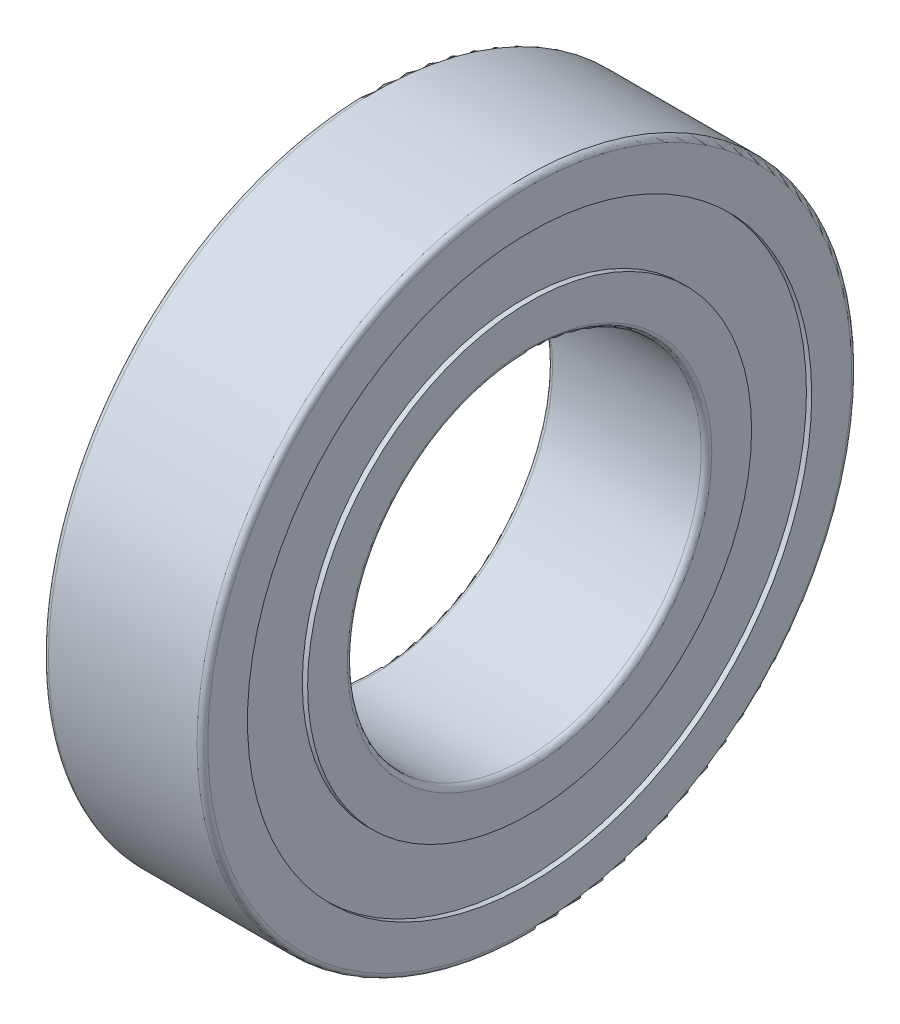
ISO-10303-21;
HEADER;
FILE_DESCRIPTION(('STEP AP214'),'2;1');
FILE_NAME('part.step','',(''),(''),'','','');
FILE_SCHEMA(('AUTOMOTIVE_DESIGN { 1 0 10303 214 1 1 1 1 }'));
ENDSEC;
DATA;
#1=APPLICATION_CONTEXT('core data for automotive mechanical design processes');
#2=APPLICATION_PROTOCOL_DEFINITION('international standard','automotive_design',2000,#1);
#3=PRODUCT_CONTEXT('',#1,'mechanical');
#4=PRODUCT('Part','Part','',(#3));
#5=PRODUCT_RELATED_PRODUCT_CATEGORY('part','',(#4));
#6=PRODUCT_DEFINITION_FORMATION('','',#4);
#7=PRODUCT_DEFINITION_CONTEXT('part definition',#1,'design');
#8=PRODUCT_DEFINITION('design','',#6,#7);
#9=PRODUCT_DEFINITION_SHAPE('','',#8);
#10=(LENGTH_UNIT() NAMED_UNIT(*) SI_UNIT(.MILLI.,.METRE.));
#11=(NAMED_UNIT(*) PLANE_ANGLE_UNIT() SI_UNIT($,.RADIAN.));
#12=(NAMED_UNIT(*) SI_UNIT($,.STERADIAN.) SOLID_ANGLE_UNIT());
#13=UNCERTAINTY_MEASURE_WITH_UNIT(LENGTH_MEASURE(1.E-05),#10,'distance_accuracy_value','');
#14=(GEOMETRIC_REPRESENTATION_CONTEXT(3) GLOBAL_UNCERTAINTY_ASSIGNED_CONTEXT((#13)) GLOBAL_UNIT_ASSIGNED_CONTEXT((#10,
#11,#12)) REPRESENTATION_CONTEXT('',''));
#15=CARTESIAN_POINT('',(0.,0.,0.));
#16=DIRECTION('',(0.,0.,1.));
#17=DIRECTION('',(1.,0.,0.));
#18=AXIS2_PLACEMENT_3D('',#15,#16,#17);
#19=CARTESIAN_POINT('',(-4.2,0.,0.));
#20=DIRECTION('',(1.,0.,0.));
#21=DIRECTION('',(0.,0.,-1.));
#22=AXIS2_PLACEMENT_3D('',#19,#20,#21);
#23=TOROIDAL_SURFACE('',#22,18.2,0.3);
#24=CARTESIAN_POINT('',(-4.5,0.,0.));
#25=DIRECTION('',(1.,0.,0.));
#26=DIRECTION('',(0.,0.,-1.));
#27=AXIS2_PLACEMENT_3D('',#24,#25,#26);
#28=CIRCLE('',#27,18.2);
#29=CARTESIAN_POINT('',(-4.5,0.,-18.2));
#30=VERTEX_POINT('',#29);
#31=EDGE_CURVE('E10',#30,#30,#28,.T.);
#32=ORIENTED_EDGE('',*,*,#31,.T.);
#33=EDGE_LOOP('',(#32));
#34=FACE_BOUND('',#33,.T.);
#35=CARTESIAN_POINT('',(-4.2,0.,0.));
#36=DIRECTION('',(1.,0.,0.));
#37=DIRECTION('',(0.,0.,-1.));
#38=AXIS2_PLACEMENT_3D('',#35,#36,#37);
#39=CIRCLE('',#38,18.5);
#40=CARTESIAN_POINT('',(-4.2,0.,-18.5));
#41=VERTEX_POINT('',#40);
#42=EDGE_CURVE('E101',#41,#41,#39,.T.);
#43=ORIENTED_EDGE('',*,*,#42,.F.);
#44=EDGE_LOOP('',(#43));
#45=FACE_BOUND('',#44,.T.);
#46=ADVANCED_FACE('F16',(#34,#45),#23,.T.);
#47=CARTESIAN_POINT('',(-4.5,15.95,0.));
#48=DIRECTION('',(1.,0.,0.));
#49=DIRECTION('',(0.,1.,0.));
#50=AXIS2_PLACEMENT_3D('',#47,#48,#49);
#51=PLANE('',#50);
#52=CARTESIAN_POINT('',(-4.5,0.,0.));
#53=DIRECTION('',(1.,0.,0.));
#54=DIRECTION('',(0.,0.,-1.));
#55=AXIS2_PLACEMENT_3D('',#52,#53,#54);
#56=CIRCLE('',#55,15.95);
#57=CARTESIAN_POINT('',(-4.5,0.,-15.95));
#58=VERTEX_POINT('',#57);
#59=EDGE_CURVE('E26',#58,#58,#56,.T.);
#60=ORIENTED_EDGE('',*,*,#59,.T.);
#61=EDGE_LOOP('',(#60));
#62=FACE_BOUND('',#61,.T.);
#63=ORIENTED_EDGE('',*,*,#31,.F.);
#64=EDGE_LOOP('',(#63));
#65=FACE_BOUND('',#64,.T.);
#66=ADVANCED_FACE('F124',(#62,#65),#51,.F.);
#67=CARTESIAN_POINT('',(4.5,0.,0.));
#68=DIRECTION('',(-1.,0.,0.));
#69=DIRECTION('',(0.,0.,-1.));
#70=AXIS2_PLACEMENT_3D('',#67,#68,#69);
#71=CYLINDRICAL_SURFACE('',#70,15.95);
#72=ORIENTED_EDGE('',*,*,#59,.F.);
#73=EDGE_LOOP('',(#72));
#74=FACE_BOUND('',#73,.T.);
#75=CARTESIAN_POINT('',(-4.2,0.,0.));
#76=DIRECTION('',(1.,0.,0.));
#77=DIRECTION('',(0.,0.,-1.));
#78=AXIS2_PLACEMENT_3D('',#75,#76,#77);
#79=CIRCLE('',#78,15.95);
#80=CARTESIAN_POINT('',(-4.2,0.,-15.95));
#81=VERTEX_POINT('',#80);
#82=EDGE_CURVE('E116',#81,#81,#79,.T.);
#83=ORIENTED_EDGE('',*,*,#82,.T.);
#84=EDGE_LOOP('',(#83));
#85=FACE_BOUND('',#84,.T.);
#86=ADVANCED_FACE('F127',(#74,#85),#71,.F.);
#87=CARTESIAN_POINT('',(-4.2,12.55,0.));
#88=DIRECTION('',(1.,0.,0.));
#89=DIRECTION('',(0.,1.,0.));
#90=AXIS2_PLACEMENT_3D('',#87,#88,#89);
#91=PLANE('',#90);
#92=CARTESIAN_POINT('',(-4.2,0.,0.));
#93=DIRECTION('',(1.,0.,0.));
#94=DIRECTION('',(0.,0.,-1.));
#95=AXIS2_PLACEMENT_3D('',#92,#93,#94);
#96=CIRCLE('',#95,12.55);
#97=CARTESIAN_POINT('',(-4.2,0.,-12.55));
#98=VERTEX_POINT('',#97);
#99=EDGE_CURVE('E106',#98,#98,#96,.T.);
#100=ORIENTED_EDGE('',*,*,#99,.T.);
#101=EDGE_LOOP('',(#100));
#102=FACE_BOUND('',#101,.T.);
#103=ORIENTED_EDGE('',*,*,#82,.F.);
#104=EDGE_LOOP('',(#103));
#105=FACE_BOUND('',#104,.T.);
#106=ADVANCED_FACE('F130',(#102,#105),#91,.F.);
#107=CARTESIAN_POINT('',(4.2,0.,0.));
#108=DIRECTION('',(1.,0.,0.));
#109=DIRECTION('',(0.,0.,-1.));
#110=AXIS2_PLACEMENT_3D('',#107,#108,#109);
#111=TOROIDAL_SURFACE('',#110,10.3,0.3);
#112=CARTESIAN_POINT('',(4.5,0.,0.));
#113=DIRECTION('',(1.,0.,0.));
#114=DIRECTION('',(0.,0.,-1.));
#115=AXIS2_PLACEMENT_3D('',#112,#113,#114);
#116=CIRCLE('',#115,10.3);
#117=CARTESIAN_POINT('',(4.5,0.,-10.3));
#118=VERTEX_POINT('',#117);
#119=EDGE_CURVE('E197',#118,#118,#116,.T.);
#120=ORIENTED_EDGE('',*,*,#119,.T.);
#121=EDGE_LOOP('',(#120));
#122=FACE_BOUND('',#121,.T.);
#123=CARTESIAN_POINT('',(4.2,0.,0.));
#124=DIRECTION('',(1.,0.,0.));
#125=DIRECTION('',(0.,0.,-1.));
#126=AXIS2_PLACEMENT_3D('',#123,#124,#125);
#127=CIRCLE('',#126,10.);
#128=CARTESIAN_POINT('',(4.2,0.,-10.));
#129=VERTEX_POINT('',#128);
#130=EDGE_CURVE('E71',#129,#129,#127,.T.);
#131=ORIENTED_EDGE('',*,*,#130,.F.);
#132=EDGE_LOOP('',(#131));
#133=FACE_BOUND('',#132,.T.);
#134=ADVANCED_FACE('F135',(#122,#133),#111,.T.);
#135=CARTESIAN_POINT('',(50.,0.,0.));
#136=DIRECTION('',(-1.,0.,0.));
#137=DIRECTION('',(0.,0.,-1.));
#138=AXIS2_PLACEMENT_3D('',#135,#136,#137);
#139=CYLINDRICAL_SURFACE('',#138,10.);
#140=ORIENTED_EDGE('',*,*,#130,.T.);
#141=EDGE_LOOP('',(#140));
#142=FACE_BOUND('',#141,.T.);
#143=CARTESIAN_POINT('',(-4.2,0.,0.));
#144=DIRECTION('',(1.,0.,0.));
#145=DIRECTION('',(0.,0.,-1.));
#146=AXIS2_PLACEMENT_3D('',#143,#144,#145);
#147=CIRCLE('',#146,10.);
#148=CARTESIAN_POINT('',(-4.2,0.,-10.));
#149=VERTEX_POINT('',#148);
#150=EDGE_CURVE('E62',#149,#149,#147,.T.);
#151=ORIENTED_EDGE('',*,*,#150,.F.);
#152=EDGE_LOOP('',(#151));
#153=FACE_BOUND('',#152,.T.);
#154=ADVANCED_FACE('F18',(#142,#153),#139,.F.);
#155=CARTESIAN_POINT('',(-4.2,0.,0.));
#156=DIRECTION('',(1.,0.,0.));
#157=DIRECTION('',(0.,0.,-1.));
#158=AXIS2_PLACEMENT_3D('',#155,#156,#157);
#159=TOROIDAL_SURFACE('',#158,10.3,0.3);
#160=ORIENTED_EDGE('',*,*,#150,.T.);
#161=EDGE_LOOP('',(#160));
#162=FACE_BOUND('',#161,.T.);
#163=CARTESIAN_POINT('',(-4.5,0.,0.));
#164=DIRECTION('',(1.,0.,0.));
#165=DIRECTION('',(0.,0.,-1.));
#166=AXIS2_PLACEMENT_3D('',#163,#164,#165);
#167=CIRCLE('',#166,10.3);
#168=CARTESIAN_POINT('',(-4.5,0.,-10.3));
#169=VERTEX_POINT('',#168);
#170=EDGE_CURVE('E100',#169,#169,#167,.T.);
#171=ORIENTED_EDGE('',*,*,#170,.F.);
#172=EDGE_LOOP('',(#171));
#173=FACE_BOUND('',#172,.T.);
#174=ADVANCED_FACE('F233',(#162,#173),#159,.T.);
#175=CARTESIAN_POINT('',(4.5,0.,0.));
#176=DIRECTION('',(-1.,0.,0.));
#177=DIRECTION('',(0.,0.,-1.));
#178=AXIS2_PLACEMENT_3D('',#175,#176,#177);
#179=CYLINDRICAL_SURFACE('',#178,12.55);
#180=ORIENTED_EDGE('',*,*,#99,.F.);
#181=EDGE_LOOP('',(#180));
#182=FACE_BOUND('',#181,.T.);
#183=CARTESIAN_POINT('',(-4.5,0.,0.));
#184=DIRECTION('',(1.,0.,0.));
#185=DIRECTION('',(0.,0.,-1.));
#186=AXIS2_PLACEMENT_3D('',#183,#184,#185);
#187=CIRCLE('',#186,12.55);
#188=CARTESIAN_POINT('',(-4.5,0.,-12.55));
#189=VERTEX_POINT('',#188);
#190=EDGE_CURVE('E96',#189,#189,#187,.T.);
#191=ORIENTED_EDGE('',*,*,#190,.T.);
#192=EDGE_LOOP('',(#191));
#193=FACE_BOUND('',#192,.T.);
#194=ADVANCED_FACE('F97',(#182,#193),#179,.T.);
#195=CARTESIAN_POINT('',(-4.5,0.,0.));
#196=DIRECTION('',(1.,0.,0.));
#197=DIRECTION('',(0.,1.,0.));
#198=AXIS2_PLACEMENT_3D('',#195,#196,#197);
#199=PLANE('',#198);
#200=ORIENTED_EDGE('',*,*,#170,.T.);
#201=EDGE_LOOP('',(#200));
#202=FACE_BOUND('',#201,.T.);
#203=ORIENTED_EDGE('',*,*,#190,.F.);
#204=EDGE_LOOP('',(#203));
#205=FACE_BOUND('',#204,.T.);
#206=ADVANCED_FACE('F252',(#202,#205),#199,.F.);
#207=CARTESIAN_POINT('',(4.5,0.,0.));
#208=DIRECTION('',(-1.,0.,0.));
#209=DIRECTION('',(0.,0.,-1.));
#210=AXIS2_PLACEMENT_3D('',#207,#208,#209);
#211=CYLINDRICAL_SURFACE('',#210,18.5);
#212=CARTESIAN_POINT('',(4.2,0.,0.));
#213=DIRECTION('',(1.,0.,0.));
#214=DIRECTION('',(0.,0.,-1.));
#215=AXIS2_PLACEMENT_3D('',#212,#213,#214);
#216=CIRCLE('',#215,18.5);
#217=CARTESIAN_POINT('',(4.2,0.,-18.5));
#218=VERTEX_POINT('',#217);
#219=EDGE_CURVE('E109',#218,#218,#216,.T.);
#220=ORIENTED_EDGE('',*,*,#219,.F.);
#221=EDGE_LOOP('',(#220));
#222=FACE_BOUND('',#221,.T.);
#223=ORIENTED_EDGE('',*,*,#42,.T.);
#224=EDGE_LOOP('',(#223));
#225=FACE_BOUND('',#224,.T.);
#226=ADVANCED_FACE('F167',(#222,#225),#211,.T.);
#227=CARTESIAN_POINT('',(4.2,0.,0.));
#228=DIRECTION('',(1.,0.,0.));
#229=DIRECTION('',(0.,0.,-1.));
#230=AXIS2_PLACEMENT_3D('',#227,#228,#229);
#231=TOROIDAL_SURFACE('',#230,18.2,0.3);
#232=ORIENTED_EDGE('',*,*,#219,.T.);
#233=EDGE_LOOP('',(#232));
#234=FACE_BOUND('',#233,.T.);
#235=CARTESIAN_POINT('',(4.5,0.,0.));
#236=DIRECTION('',(1.,0.,0.));
#237=DIRECTION('',(0.,0.,-1.));
#238=AXIS2_PLACEMENT_3D('',#235,#236,#237);
#239=CIRCLE('',#238,18.2);
#240=CARTESIAN_POINT('',(4.5,0.,-18.2));
#241=VERTEX_POINT('',#240);
#242=EDGE_CURVE('E177',#241,#241,#239,.T.);
#243=ORIENTED_EDGE('',*,*,#242,.F.);
#244=EDGE_LOOP('',(#243));
#245=FACE_BOUND('',#244,.T.);
#246=ADVANCED_FACE('F165',(#234,#245),#231,.T.);
#247=CARTESIAN_POINT('',(4.5,18.2,0.));
#248=DIRECTION('',(-1.,0.,0.));
#249=DIRECTION('',(0.,0.,1.));
#250=AXIS2_PLACEMENT_3D('',#247,#248,#249);
#251=PLANE('',#250);
#252=CARTESIAN_POINT('',(4.5,0.,0.));
#253=DIRECTION('',(1.,0.,0.));
#254=DIRECTION('',(0.,0.,-1.));
#255=AXIS2_PLACEMENT_3D('',#252,#253,#254);
#256=CIRCLE('',#255,15.95);
#257=CARTESIAN_POINT('',(4.5,0.,-15.95));
#258=VERTEX_POINT('',#257);
#259=EDGE_CURVE('E175',#258,#258,#256,.T.);
#260=ORIENTED_EDGE('',*,*,#259,.F.);
#261=EDGE_LOOP('',(#260));
#262=FACE_BOUND('',#261,.T.);
#263=ORIENTED_EDGE('',*,*,#242,.T.);
#264=EDGE_LOOP('',(#263));
#265=FACE_BOUND('',#264,.T.);
#266=ADVANCED_FACE('F160',(#262,#265),#251,.F.);
#267=CARTESIAN_POINT('',(4.5,0.,0.));
#268=DIRECTION('',(-1.,0.,0.));
#269=DIRECTION('',(0.,0.,-1.));
#270=AXIS2_PLACEMENT_3D('',#267,#268,#269);
#271=CYLINDRICAL_SURFACE('',#270,15.95);
#272=CARTESIAN_POINT('',(4.2,0.,0.));
#273=DIRECTION('',(1.,0.,0.));
#274=DIRECTION('',(0.,0.,-1.));
#275=AXIS2_PLACEMENT_3D('',#272,#273,#274);
#276=CIRCLE('',#275,15.95);
#277=CARTESIAN_POINT('',(4.2,0.,-15.95));
#278=VERTEX_POINT('',#277);
#279=EDGE_CURVE('E185',#278,#278,#276,.T.);
#280=ORIENTED_EDGE('',*,*,#279,.F.);
#281=EDGE_LOOP('',(#280));
#282=FACE_BOUND('',#281,.T.);
#283=ORIENTED_EDGE('',*,*,#259,.T.);
#284=EDGE_LOOP('',(#283));
#285=FACE_BOUND('',#284,.T.);
#286=ADVANCED_FACE('F156',(#282,#285),#271,.F.);
#287=CARTESIAN_POINT('',(4.2,15.95,0.));
#288=DIRECTION('',(-1.,0.,0.));
#289=DIRECTION('',(0.,0.,1.));
#290=AXIS2_PLACEMENT_3D('',#287,#288,#289);
#291=PLANE('',#290);
#292=CARTESIAN_POINT('',(4.2,0.,0.));
#293=DIRECTION('',(1.,0.,0.));
#294=DIRECTION('',(0.,0.,-1.));
#295=AXIS2_PLACEMENT_3D('',#292,#293,#294);
#296=CIRCLE('',#295,12.55);
#297=CARTESIAN_POINT('',(4.2,0.,-12.55));
#298=VERTEX_POINT('',#297);
#299=EDGE_CURVE('E193',#298,#298,#296,.T.);
#300=ORIENTED_EDGE('',*,*,#299,.F.);
#301=EDGE_LOOP('',(#300));
#302=FACE_BOUND('',#301,.T.);
#303=ORIENTED_EDGE('',*,*,#279,.T.);
#304=EDGE_LOOP('',(#303));
#305=FACE_BOUND('',#304,.T.);
#306=ADVANCED_FACE('F159',(#302,#305),#291,.F.);
#307=CARTESIAN_POINT('',(4.5,0.,0.));
#308=DIRECTION('',(-1.,0.,0.));
#309=DIRECTION('',(0.,0.,-1.));
#310=AXIS2_PLACEMENT_3D('',#307,#308,#309);
#311=CYLINDRICAL_SURFACE('',#310,12.55);
#312=CARTESIAN_POINT('',(4.5,0.,0.));
#313=DIRECTION('',(1.,0.,0.));
#314=DIRECTION('',(0.,0.,-1.));
#315=AXIS2_PLACEMENT_3D('',#312,#313,#314);
#316=CIRCLE('',#315,12.55);
#317=CARTESIAN_POINT('',(4.5,0.,-12.55));
#318=VERTEX_POINT('',#317);
#319=EDGE_CURVE('E201',#318,#318,#316,.T.);
#320=ORIENTED_EDGE('',*,*,#319,.F.);
#321=EDGE_LOOP('',(#320));
#322=FACE_BOUND('',#321,.T.);
#323=ORIENTED_EDGE('',*,*,#299,.T.);
#324=EDGE_LOOP('',(#323));
#325=FACE_BOUND('',#324,.T.);
#326=ADVANCED_FACE('F155',(#322,#325),#311,.T.);
#327=CARTESIAN_POINT('',(4.5,12.55,0.));
#328=DIRECTION('',(-1.,0.,0.));
#329=DIRECTION('',(0.,0.,1.));
#330=AXIS2_PLACEMENT_3D('',#327,#328,#329);
#331=PLANE('',#330);
#332=ORIENTED_EDGE('',*,*,#119,.F.);
#333=EDGE_LOOP('',(#332));
#334=FACE_BOUND('',#333,.T.);
#335=ORIENTED_EDGE('',*,*,#319,.T.);
#336=EDGE_LOOP('',(#335));
#337=FACE_BOUND('',#336,.T.);
#338=ADVANCED_FACE('F208',(#334,#337),#331,.F.);
#339=CLOSED_SHELL('',(#46,#66,#86,#106,#134,#154,#174,#194,#206,#226,#246,#266,#286,#306,#326,#338));
#340=MANIFOLD_SOLID_BREP('B1',#339);
#341=ADVANCED_BREP_SHAPE_REPRESENTATION('',(#18,#340),#14);
#342=SHAPE_DEFINITION_REPRESENTATION(#9,#341);
ENDSEC;
END-ISO-10303-21;
